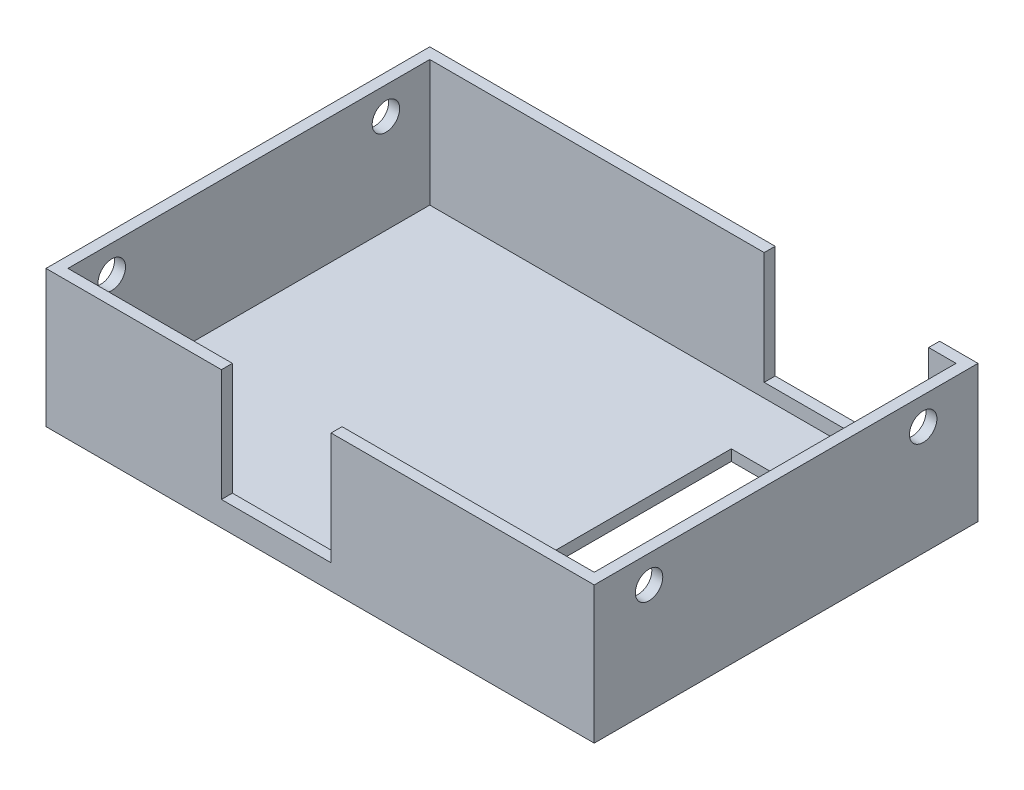
ISO-10303-21;
HEADER;
FILE_DESCRIPTION(('STEP AP214'),'2;1');
FILE_NAME('part.step','',(''),(''),'','','');
FILE_SCHEMA(('AUTOMOTIVE_DESIGN { 1 0 10303 214 1 1 1 1 }'));
ENDSEC;
DATA;
#1=APPLICATION_CONTEXT('core data for automotive mechanical design processes');
#2=APPLICATION_PROTOCOL_DEFINITION('international standard','automotive_design',2000,#1);
#3=PRODUCT_CONTEXT('',#1,'mechanical');
#4=PRODUCT('Part','Part','',(#3));
#5=PRODUCT_RELATED_PRODUCT_CATEGORY('part','',(#4));
#6=PRODUCT_DEFINITION_FORMATION('','',#4);
#7=PRODUCT_DEFINITION_CONTEXT('part definition',#1,'design');
#8=PRODUCT_DEFINITION('design','',#6,#7);
#9=PRODUCT_DEFINITION_SHAPE('','',#8);
#10=(LENGTH_UNIT() NAMED_UNIT(*) SI_UNIT(.MILLI.,.METRE.));
#11=(NAMED_UNIT(*) PLANE_ANGLE_UNIT() SI_UNIT($,.RADIAN.));
#12=(NAMED_UNIT(*) SI_UNIT($,.STERADIAN.) SOLID_ANGLE_UNIT());
#13=UNCERTAINTY_MEASURE_WITH_UNIT(LENGTH_MEASURE(1.E-05),#10,'distance_accuracy_value','');
#14=(GEOMETRIC_REPRESENTATION_CONTEXT(3) GLOBAL_UNCERTAINTY_ASSIGNED_CONTEXT((#13)) GLOBAL_UNIT_ASSIGNED_CONTEXT((#10,
#11,#12)) REPRESENTATION_CONTEXT('',''));
#15=CARTESIAN_POINT('',(0.,0.,0.));
#16=DIRECTION('',(0.,0.,1.));
#17=DIRECTION('',(1.,0.,0.));
#18=AXIS2_PLACEMENT_3D('',#15,#16,#17);
#19=CARTESIAN_POINT('',(0.,31.75,0.));
#20=DIRECTION('',(0.,-1.,0.));
#21=DIRECTION('',(0.,0.,-1.));
#22=AXIS2_PLACEMENT_3D('',#19,#20,#21);
#23=PLANE('',#22);
#24=DIRECTION('',(1.,0.,0.));
#25=VECTOR('',#24,1.);
#26=CARTESIAN_POINT('',(0.,31.75,0.));
#27=LINE('',#26,#25);
#28=CARTESIAN_POINT('',(0.,31.75,0.));
#29=VERTEX_POINT('',#28);
#30=CARTESIAN_POINT('',(40.64,31.75,0.));
#31=VERTEX_POINT('',#30);
#32=EDGE_CURVE('E370',#29,#31,#27,.T.);
#33=ORIENTED_EDGE('',*,*,#32,.T.);
#34=DIRECTION('',(0.,0.,1.));
#35=VECTOR('',#34,1.);
#36=CARTESIAN_POINT('',(40.64,31.75,-2.54));
#37=LINE('',#36,#35);
#38=CARTESIAN_POINT('',(40.64,31.75,-2.54));
#39=VERTEX_POINT('',#38);
#40=EDGE_CURVE('E250',#39,#31,#37,.T.);
#41=ORIENTED_EDGE('',*,*,#40,.F.);
#42=DIRECTION('',(1.,0.,0.));
#43=VECTOR('',#42,1.);
#44=CARTESIAN_POINT('',(0.,31.75,-2.54));
#45=LINE('',#44,#43);
#46=CARTESIAN_POINT('',(2.54,31.75,-2.54));
#47=VERTEX_POINT('',#46);
#48=EDGE_CURVE('E352',#47,#39,#45,.T.);
#49=ORIENTED_EDGE('',*,*,#48,.F.);
#50=DIRECTION('',(0.,0.,1.));
#51=VECTOR('',#50,1.);
#52=CARTESIAN_POINT('',(2.54,31.75,0.));
#53=LINE('',#52,#51);
#54=CARTESIAN_POINT('',(2.53999999999995,31.75,-86.36));
#55=VERTEX_POINT('',#54);
#56=EDGE_CURVE('E348',#55,#47,#53,.T.);
#57=ORIENTED_EDGE('',*,*,#56,.F.);
#58=DIRECTION('',(-1.,0.,0.));
#59=VECTOR('',#58,1.);
#60=CARTESIAN_POINT('',(0.,31.75,-86.36));
#61=LINE('',#60,#59);
#62=CARTESIAN_POINT('',(80.0099999999999,31.75,-86.36));
#63=VERTEX_POINT('',#62);
#64=EDGE_CURVE('E360',#63,#55,#61,.T.);
#65=ORIENTED_EDGE('',*,*,#64,.F.);
#66=DIRECTION('',(0.,0.,-1.));
#67=VECTOR('',#66,1.);
#68=CARTESIAN_POINT('',(80.0099999999999,31.75,-86.36));
#69=LINE('',#68,#67);
#70=CARTESIAN_POINT('',(80.0099999999999,31.75,-88.9));
#71=VERTEX_POINT('',#70);
#72=EDGE_CURVE('E290',#63,#71,#69,.T.);
#73=ORIENTED_EDGE('',*,*,#72,.T.);
#74=DIRECTION('',(-1.,0.,0.));
#75=VECTOR('',#74,1.);
#76=CARTESIAN_POINT('',(0.,31.75,-88.9));
#77=LINE('',#76,#75);
#78=CARTESIAN_POINT('',(0.,31.75,-88.9));
#79=VERTEX_POINT('',#78);
#80=EDGE_CURVE('E377',#71,#79,#77,.T.);
#81=ORIENTED_EDGE('',*,*,#80,.T.);
#82=DIRECTION('',(0.,0.,1.));
#83=VECTOR('',#82,1.);
#84=CARTESIAN_POINT('',(0.,31.75,0.));
#85=LINE('',#84,#83);
#86=EDGE_CURVE('E364',#79,#29,#85,.T.);
#87=ORIENTED_EDGE('',*,*,#86,.T.);
#88=EDGE_LOOP('',(#33,#41,#49,#57,#65,#73,#81,#87));
#89=FACE_BOUND('',#88,.T.);
#90=ADVANCED_FACE('F38',(#89),#23,.F.);
#91=CARTESIAN_POINT('',(66.04,31.75,-2.54));
#92=VERTEX_POINT('',#91);
#93=CARTESIAN_POINT('',(124.46,31.75,-2.54));
#94=VERTEX_POINT('',#93);
#95=EDGE_CURVE('E351',#92,#94,#45,.T.);
#96=ORIENTED_EDGE('',*,*,#95,.F.);
#97=DIRECTION('',(0.,0.,1.));
#98=VECTOR('',#97,1.);
#99=CARTESIAN_POINT('',(66.04,31.75,-2.54));
#100=LINE('',#99,#98);
#101=CARTESIAN_POINT('',(66.04,31.75,0.));
#102=VERTEX_POINT('',#101);
#103=EDGE_CURVE('E254',#92,#102,#100,.T.);
#104=ORIENTED_EDGE('',*,*,#103,.T.);
#105=CARTESIAN_POINT('',(127.,31.75,0.));
#106=VERTEX_POINT('',#105);
#107=EDGE_CURVE('E368',#102,#106,#27,.T.);
#108=ORIENTED_EDGE('',*,*,#107,.T.);
#109=DIRECTION('',(0.,0.,-1.));
#110=VECTOR('',#109,1.);
#111=CARTESIAN_POINT('',(127.,31.75,0.));
#112=LINE('',#111,#110);
#113=CARTESIAN_POINT('',(127.,31.75,-88.9));
#114=VERTEX_POINT('',#113);
#115=EDGE_CURVE('E374',#106,#114,#112,.T.);
#116=ORIENTED_EDGE('',*,*,#115,.T.);
#117=CARTESIAN_POINT('',(118.11,31.75,-88.9));
#118=VERTEX_POINT('',#117);
#119=EDGE_CURVE('E378',#114,#118,#77,.T.);
#120=ORIENTED_EDGE('',*,*,#119,.T.);
#121=DIRECTION('',(0.,0.,-1.));
#122=VECTOR('',#121,1.);
#123=CARTESIAN_POINT('',(118.11,31.75,-86.36));
#124=LINE('',#123,#122);
#125=CARTESIAN_POINT('',(118.11,31.75,-86.36));
#126=VERTEX_POINT('',#125);
#127=EDGE_CURVE('E286',#126,#118,#124,.T.);
#128=ORIENTED_EDGE('',*,*,#127,.F.);
#129=CARTESIAN_POINT('',(124.46,31.75,-86.36));
#130=VERTEX_POINT('',#129);
#131=EDGE_CURVE('E333',#130,#126,#61,.T.);
#132=ORIENTED_EDGE('',*,*,#131,.F.);
#133=DIRECTION('',(0.,0.,-1.));
#134=VECTOR('',#133,1.);
#135=CARTESIAN_POINT('',(124.46,31.75,0.));
#136=LINE('',#135,#134);
#137=EDGE_CURVE('E356',#94,#130,#136,.T.);
#138=ORIENTED_EDGE('',*,*,#137,.F.);
#139=EDGE_LOOP('',(#96,#104,#108,#116,#120,#128,#132,#138));
#140=FACE_BOUND('',#139,.T.);
#141=ADVANCED_FACE('F430',(#140),#23,.F.);
#142=CARTESIAN_POINT('',(0.,31.75,0.));
#143=DIRECTION('',(1.,0.,0.));
#144=DIRECTION('',(0.,0.,-1.));
#145=AXIS2_PLACEMENT_3D('',#142,#143,#144);
#146=PLANE('',#145);
#147=CARTESIAN_POINT('',(0.,25.4,-12.6999999999999));
#148=DIRECTION('',(1.,0.,0.));
#149=DIRECTION('',(0.,0.,-1.));
#150=AXIS2_PLACEMENT_3D('',#147,#148,#149);
#151=CIRCLE('',#150,3.175);
#152=CARTESIAN_POINT('',(0.,25.4,-15.8749999999999));
#153=VERTEX_POINT('',#152);
#154=EDGE_CURVE('E299',#153,#153,#151,.T.);
#155=ORIENTED_EDGE('',*,*,#154,.T.);
#156=EDGE_LOOP('',(#155));
#157=FACE_BOUND('',#156,.T.);
#158=CARTESIAN_POINT('',(0.,25.4,-76.1999999999999));
#159=DIRECTION('',(1.,0.,0.));
#160=DIRECTION('',(0.,0.,-1.));
#161=AXIS2_PLACEMENT_3D('',#158,#159,#160);
#162=CIRCLE('',#161,3.175);
#163=CARTESIAN_POINT('',(0.,25.4,-79.3749999999999));
#164=VERTEX_POINT('',#163);
#165=EDGE_CURVE('E289',#164,#164,#162,.T.);
#166=ORIENTED_EDGE('',*,*,#165,.T.);
#167=EDGE_LOOP('',(#166));
#168=FACE_BOUND('',#167,.T.);
#169=DIRECTION('',(0.,0.,1.));
#170=VECTOR('',#169,1.);
#171=CARTESIAN_POINT('',(0.,0.,0.));
#172=LINE('',#171,#170);
#173=CARTESIAN_POINT('',(0.,0.,-88.9));
#174=VERTEX_POINT('',#173);
#175=CARTESIAN_POINT('',(0.,0.,0.));
#176=VERTEX_POINT('',#175);
#177=EDGE_CURVE('E326',#174,#176,#172,.T.);
#178=ORIENTED_EDGE('',*,*,#177,.T.);
#179=DIRECTION('',(0.,-1.,0.));
#180=VECTOR('',#179,1.);
#181=CARTESIAN_POINT('',(0.,31.75,0.));
#182=LINE('',#181,#180);
#183=EDGE_CURVE('E11',#29,#176,#182,.T.);
#184=ORIENTED_EDGE('',*,*,#183,.F.);
#185=ORIENTED_EDGE('',*,*,#86,.F.);
#186=DIRECTION('',(0.,-1.,0.));
#187=VECTOR('',#186,1.);
#188=CARTESIAN_POINT('',(0.,31.75,-88.9));
#189=LINE('',#188,#187);
#190=EDGE_CURVE('E382',#79,#174,#189,.T.);
#191=ORIENTED_EDGE('',*,*,#190,.T.);
#192=EDGE_LOOP('',(#178,#184,#185,#191));
#193=FACE_BOUND('',#192,.T.);
#194=ADVANCED_FACE('F40',(#157,#168,#193),#146,.F.);
#195=CARTESIAN_POINT('',(0.,31.75,0.));
#196=DIRECTION('',(0.,0.,-1.));
#197=DIRECTION('',(-1.,0.,0.));
#198=AXIS2_PLACEMENT_3D('',#195,#196,#197);
#199=PLANE('',#198);
#200=DIRECTION('',(1.,0.,0.));
#201=VECTOR('',#200,1.);
#202=CARTESIAN_POINT('',(40.64,5.715,0.));
#203=LINE('',#202,#201);
#204=CARTESIAN_POINT('',(40.64,5.715,0.));
#205=VERTEX_POINT('',#204);
#206=CARTESIAN_POINT('',(66.04,5.715,0.));
#207=VERTEX_POINT('',#206);
#208=EDGE_CURVE('E244',#205,#207,#203,.T.);
#209=ORIENTED_EDGE('',*,*,#208,.F.);
#210=DIRECTION('',(0.,-1.,0.));
#211=VECTOR('',#210,1.);
#212=CARTESIAN_POINT('',(40.64,31.75,0.));
#213=LINE('',#212,#211);
#214=EDGE_CURVE('E221',#31,#205,#213,.T.);
#215=ORIENTED_EDGE('',*,*,#214,.F.);
#216=ORIENTED_EDGE('',*,*,#32,.F.);
#217=ORIENTED_EDGE('',*,*,#183,.T.);
#218=DIRECTION('',(1.,0.,0.));
#219=VECTOR('',#218,1.);
#220=CARTESIAN_POINT('',(0.,0.,0.));
#221=LINE('',#220,#219);
#222=CARTESIAN_POINT('',(127.,0.,0.));
#223=VERTEX_POINT('',#222);
#224=EDGE_CURVE('E386',#176,#223,#221,.T.);
#225=ORIENTED_EDGE('',*,*,#224,.T.);
#226=DIRECTION('',(0.,-1.,0.));
#227=VECTOR('',#226,1.);
#228=CARTESIAN_POINT('',(127.,31.75,0.));
#229=LINE('',#228,#227);
#230=EDGE_CURVE('E48',#106,#223,#229,.T.);
#231=ORIENTED_EDGE('',*,*,#230,.F.);
#232=ORIENTED_EDGE('',*,*,#107,.F.);
#233=DIRECTION('',(0.,1.,0.));
#234=VECTOR('',#233,1.);
#235=CARTESIAN_POINT('',(66.04,31.75,0.));
#236=LINE('',#235,#234);
#237=EDGE_CURVE('E232',#207,#102,#236,.T.);
#238=ORIENTED_EDGE('',*,*,#237,.F.);
#239=EDGE_LOOP('',(#209,#215,#216,#217,#225,#231,#232,#238));
#240=FACE_BOUND('',#239,.T.);
#241=ADVANCED_FACE('F429',(#240),#199,.F.);
#242=CARTESIAN_POINT('',(127.,31.75,0.));
#243=DIRECTION('',(-1.,0.,0.));
#244=DIRECTION('',(0.,0.,1.));
#245=AXIS2_PLACEMENT_3D('',#242,#243,#244);
#246=PLANE('',#245);
#247=CARTESIAN_POINT('',(127.,25.4,-12.7));
#248=DIRECTION('',(1.,0.,0.));
#249=DIRECTION('',(0.,0.,-1.));
#250=AXIS2_PLACEMENT_3D('',#247,#248,#249);
#251=CIRCLE('',#250,3.175);
#252=CARTESIAN_POINT('',(127.,25.4,-15.875));
#253=VERTEX_POINT('',#252);
#254=EDGE_CURVE('E307',#253,#253,#251,.T.);
#255=ORIENTED_EDGE('',*,*,#254,.F.);
#256=EDGE_LOOP('',(#255));
#257=FACE_BOUND('',#256,.T.);
#258=CARTESIAN_POINT('',(127.,25.4,-76.2));
#259=DIRECTION('',(1.,0.,0.));
#260=DIRECTION('',(0.,0.,-1.));
#261=AXIS2_PLACEMENT_3D('',#258,#259,#260);
#262=CIRCLE('',#261,3.175);
#263=CARTESIAN_POINT('',(127.,25.4,-79.375));
#264=VERTEX_POINT('',#263);
#265=EDGE_CURVE('E312',#264,#264,#262,.T.);
#266=ORIENTED_EDGE('',*,*,#265,.F.);
#267=EDGE_LOOP('',(#266));
#268=FACE_BOUND('',#267,.T.);
#269=DIRECTION('',(0.,0.,-1.));
#270=VECTOR('',#269,1.);
#271=CARTESIAN_POINT('',(127.,0.,0.));
#272=LINE('',#271,#270);
#273=CARTESIAN_POINT('',(127.,0.,-88.9));
#274=VERTEX_POINT('',#273);
#275=EDGE_CURVE('E389',#223,#274,#272,.T.);
#276=ORIENTED_EDGE('',*,*,#275,.T.);
#277=DIRECTION('',(0.,-1.,0.));
#278=VECTOR('',#277,1.);
#279=CARTESIAN_POINT('',(127.,31.75,-88.9));
#280=LINE('',#279,#278);
#281=EDGE_CURVE('E397',#114,#274,#280,.T.);
#282=ORIENTED_EDGE('',*,*,#281,.F.);
#283=ORIENTED_EDGE('',*,*,#115,.F.);
#284=ORIENTED_EDGE('',*,*,#230,.T.);
#285=EDGE_LOOP('',(#276,#282,#283,#284));
#286=FACE_BOUND('',#285,.T.);
#287=ADVANCED_FACE('F459',(#257,#268,#286),#246,.F.);
#288=CARTESIAN_POINT('',(0.,31.75,-88.9));
#289=DIRECTION('',(0.,0.,1.));
#290=DIRECTION('',(1.,0.,0.));
#291=AXIS2_PLACEMENT_3D('',#288,#289,#290);
#292=PLANE('',#291);
#293=DIRECTION('',(-1.,0.,0.));
#294=VECTOR('',#293,1.);
#295=CARTESIAN_POINT('',(118.11,5.715,-88.9));
#296=LINE('',#295,#294);
#297=CARTESIAN_POINT('',(118.11,5.715,-88.9));
#298=VERTEX_POINT('',#297);
#299=CARTESIAN_POINT('',(80.0099999999999,5.715,-88.9));
#300=VERTEX_POINT('',#299);
#301=EDGE_CURVE('E280',#298,#300,#296,.T.);
#302=ORIENTED_EDGE('',*,*,#301,.F.);
#303=DIRECTION('',(0.,-1.,0.));
#304=VECTOR('',#303,1.);
#305=CARTESIAN_POINT('',(118.11,31.75,-88.9));
#306=LINE('',#305,#304);
#307=EDGE_CURVE('E253',#118,#298,#306,.T.);
#308=ORIENTED_EDGE('',*,*,#307,.F.);
#309=ORIENTED_EDGE('',*,*,#119,.F.);
#310=ORIENTED_EDGE('',*,*,#281,.T.);
#311=DIRECTION('',(-1.,0.,0.));
#312=VECTOR('',#311,1.);
#313=CARTESIAN_POINT('',(0.,0.,-88.9));
#314=LINE('',#313,#312);
#315=EDGE_CURVE('E369',#274,#174,#314,.T.);
#316=ORIENTED_EDGE('',*,*,#315,.T.);
#317=ORIENTED_EDGE('',*,*,#190,.F.);
#318=ORIENTED_EDGE('',*,*,#80,.F.);
#319=DIRECTION('',(0.,1.,0.));
#320=VECTOR('',#319,1.);
#321=CARTESIAN_POINT('',(80.0099999999999,31.75,-88.9));
#322=LINE('',#321,#320);
#323=EDGE_CURVE('E268',#300,#71,#322,.T.);
#324=ORIENTED_EDGE('',*,*,#323,.F.);
#325=EDGE_LOOP('',(#302,#308,#309,#310,#316,#317,#318,#324));
#326=FACE_BOUND('',#325,.T.);
#327=ADVANCED_FACE('F453',(#326),#292,.F.);
#328=CARTESIAN_POINT('',(0.,0.,0.));
#329=DIRECTION('',(0.,-1.,0.));
#330=DIRECTION('',(0.,0.,-1.));
#331=AXIS2_PLACEMENT_3D('',#328,#329,#330);
#332=PLANE('',#331);
#333=DIRECTION('',(0.,0.,-1.));
#334=VECTOR('',#333,1.);
#335=CARTESIAN_POINT('',(86.36,0.,-8.89));
#336=LINE('',#335,#334);
#337=CARTESIAN_POINT('',(86.36,0.,-8.89));
#338=VERTEX_POINT('',#337);
#339=CARTESIAN_POINT('',(86.36,0.,-72.39));
#340=VERTEX_POINT('',#339);
#341=EDGE_CURVE('E56',#338,#340,#336,.T.);
#342=ORIENTED_EDGE('',*,*,#341,.F.);
#343=DIRECTION('',(-1.,0.,0.));
#344=VECTOR('',#343,1.);
#345=CARTESIAN_POINT('',(86.36,0.,-8.89));
#346=LINE('',#345,#344);
#347=CARTESIAN_POINT('',(111.76,0.,-8.89));
#348=VERTEX_POINT('',#347);
#349=EDGE_CURVE('E199',#348,#338,#346,.T.);
#350=ORIENTED_EDGE('',*,*,#349,.F.);
#351=DIRECTION('',(0.,0.,1.));
#352=VECTOR('',#351,1.);
#353=CARTESIAN_POINT('',(111.76,0.,-8.89));
#354=LINE('',#353,#352);
#355=CARTESIAN_POINT('',(111.76,0.,-72.39));
#356=VERTEX_POINT('',#355);
#357=EDGE_CURVE('E203',#356,#348,#354,.T.);
#358=ORIENTED_EDGE('',*,*,#357,.F.);
#359=DIRECTION('',(1.,0.,0.));
#360=VECTOR('',#359,1.);
#361=CARTESIAN_POINT('',(86.36,0.,-72.39));
#362=LINE('',#361,#360);
#363=EDGE_CURVE('E212',#340,#356,#362,.T.);
#364=ORIENTED_EDGE('',*,*,#363,.F.);
#365=EDGE_LOOP('',(#342,#350,#358,#364));
#366=FACE_BOUND('',#365,.T.);
#367=ORIENTED_EDGE('',*,*,#177,.F.);
#368=ORIENTED_EDGE('',*,*,#315,.F.);
#369=ORIENTED_EDGE('',*,*,#275,.F.);
#370=ORIENTED_EDGE('',*,*,#224,.F.);
#371=EDGE_LOOP('',(#367,#368,#369,#370));
#372=FACE_BOUND('',#371,.T.);
#373=ADVANCED_FACE('F439',(#366,#372),#332,.T.);
#374=CARTESIAN_POINT('',(2.54,31.75,0.));
#375=DIRECTION('',(1.,0.,0.));
#376=DIRECTION('',(0.,0.,-1.));
#377=AXIS2_PLACEMENT_3D('',#374,#375,#376);
#378=PLANE('',#377);
#379=CARTESIAN_POINT('',(2.53999999999999,25.4,-12.6999999999999));
#380=DIRECTION('',(1.,0.,0.));
#381=DIRECTION('',(0.,0.,-1.));
#382=AXIS2_PLACEMENT_3D('',#379,#380,#381);
#383=CIRCLE('',#382,3.175);
#384=CARTESIAN_POINT('',(2.53999999999999,25.4,-15.8749999999999));
#385=VERTEX_POINT('',#384);
#386=EDGE_CURVE('E42',#385,#385,#383,.F.);
#387=ORIENTED_EDGE('',*,*,#386,.T.);
#388=EDGE_LOOP('',(#387));
#389=FACE_BOUND('',#388,.T.);
#390=CARTESIAN_POINT('',(2.53999999999995,25.4,-76.1999999999999));
#391=DIRECTION('',(1.,0.,0.));
#392=DIRECTION('',(0.,0.,-1.));
#393=AXIS2_PLACEMENT_3D('',#390,#391,#392);
#394=CIRCLE('',#393,3.175);
#395=CARTESIAN_POINT('',(2.53999999999995,25.4,-79.3749999999999));
#396=VERTEX_POINT('',#395);
#397=EDGE_CURVE('E303',#396,#396,#394,.F.);
#398=ORIENTED_EDGE('',*,*,#397,.T.);
#399=EDGE_LOOP('',(#398));
#400=FACE_BOUND('',#399,.T.);
#401=DIRECTION('',(0.,0.,1.));
#402=VECTOR('',#401,1.);
#403=CARTESIAN_POINT('',(2.54,2.54,0.));
#404=LINE('',#403,#402);
#405=CARTESIAN_POINT('',(2.53999999999995,2.54,-86.36));
#406=VERTEX_POINT('',#405);
#407=CARTESIAN_POINT('',(2.54,2.54,-2.54));
#408=VERTEX_POINT('',#407);
#409=EDGE_CURVE('E316',#406,#408,#404,.T.);
#410=ORIENTED_EDGE('',*,*,#409,.F.);
#411=DIRECTION('',(0.,-1.,0.));
#412=VECTOR('',#411,1.);
#413=CARTESIAN_POINT('',(2.53999999999995,31.75,-86.36));
#414=LINE('',#413,#412);
#415=EDGE_CURVE('E328',#55,#406,#414,.T.);
#416=ORIENTED_EDGE('',*,*,#415,.F.);
#417=ORIENTED_EDGE('',*,*,#56,.T.);
#418=DIRECTION('',(0.,-1.,0.));
#419=VECTOR('',#418,1.);
#420=CARTESIAN_POINT('',(2.54,31.75,-2.54));
#421=LINE('',#420,#419);
#422=EDGE_CURVE('E322',#47,#408,#421,.T.);
#423=ORIENTED_EDGE('',*,*,#422,.T.);
#424=EDGE_LOOP('',(#410,#416,#417,#423));
#425=FACE_BOUND('',#424,.T.);
#426=ADVANCED_FACE('F417',(#389,#400,#425),#378,.T.);
#427=CARTESIAN_POINT('',(0.,31.75,-2.54));
#428=DIRECTION('',(0.,0.,-1.));
#429=DIRECTION('',(-1.,0.,0.));
#430=AXIS2_PLACEMENT_3D('',#427,#428,#429);
#431=PLANE('',#430);
#432=DIRECTION('',(0.,-1.,0.));
#433=VECTOR('',#432,1.);
#434=CARTESIAN_POINT('',(40.64,31.75,-2.54));
#435=LINE('',#434,#433);
#436=CARTESIAN_POINT('',(40.64,5.715,-2.54));
#437=VERTEX_POINT('',#436);
#438=EDGE_CURVE('E227',#39,#437,#435,.T.);
#439=ORIENTED_EDGE('',*,*,#438,.T.);
#440=DIRECTION('',(1.,0.,0.));
#441=VECTOR('',#440,1.);
#442=CARTESIAN_POINT('',(40.64,5.715,-2.54));
#443=LINE('',#442,#441);
#444=CARTESIAN_POINT('',(66.04,5.715,-2.54));
#445=VERTEX_POINT('',#444);
#446=EDGE_CURVE('E231',#437,#445,#443,.T.);
#447=ORIENTED_EDGE('',*,*,#446,.T.);
#448=DIRECTION('',(0.,1.,0.));
#449=VECTOR('',#448,1.);
#450=CARTESIAN_POINT('',(66.04,31.75,-2.54));
#451=LINE('',#450,#449);
#452=EDGE_CURVE('E236',#445,#92,#451,.T.);
#453=ORIENTED_EDGE('',*,*,#452,.T.);
#454=ORIENTED_EDGE('',*,*,#95,.T.);
#455=DIRECTION('',(0.,-1.,0.));
#456=VECTOR('',#455,1.);
#457=CARTESIAN_POINT('',(124.46,31.75,-2.54));
#458=LINE('',#457,#456);
#459=CARTESIAN_POINT('',(124.46,2.54,-2.54));
#460=VERTEX_POINT('',#459);
#461=EDGE_CURVE('E327',#94,#460,#458,.T.);
#462=ORIENTED_EDGE('',*,*,#461,.T.);
#463=DIRECTION('',(1.,0.,0.));
#464=VECTOR('',#463,1.);
#465=CARTESIAN_POINT('',(0.,2.54,-2.54));
#466=LINE('',#465,#464);
#467=EDGE_CURVE('E320',#408,#460,#466,.T.);
#468=ORIENTED_EDGE('',*,*,#467,.F.);
#469=ORIENTED_EDGE('',*,*,#422,.F.);
#470=ORIENTED_EDGE('',*,*,#48,.T.);
#471=EDGE_LOOP('',(#439,#447,#453,#454,#462,#468,#469,#470));
#472=FACE_BOUND('',#471,.T.);
#473=ADVANCED_FACE('F469',(#472),#431,.T.);
#474=CARTESIAN_POINT('',(124.46,31.75,0.));
#475=DIRECTION('',(-1.,0.,0.));
#476=DIRECTION('',(0.,0.,1.));
#477=AXIS2_PLACEMENT_3D('',#474,#475,#476);
#478=PLANE('',#477);
#479=CARTESIAN_POINT('',(124.46,25.4,-12.7));
#480=DIRECTION('',(-1.,0.,0.));
#481=DIRECTION('',(0.,0.,1.));
#482=AXIS2_PLACEMENT_3D('',#479,#480,#481);
#483=CIRCLE('',#482,3.175);
#484=CARTESIAN_POINT('',(124.46,25.4,-9.525));
#485=VERTEX_POINT('',#484);
#486=EDGE_CURVE('E321',#485,#485,#483,.T.);
#487=ORIENTED_EDGE('',*,*,#486,.F.);
#488=EDGE_LOOP('',(#487));
#489=FACE_BOUND('',#488,.T.);
#490=CARTESIAN_POINT('',(124.46,25.4,-76.2));
#491=DIRECTION('',(-1.,0.,0.));
#492=DIRECTION('',(0.,0.,1.));
#493=AXIS2_PLACEMENT_3D('',#490,#491,#492);
#494=CIRCLE('',#493,3.175);
#495=CARTESIAN_POINT('',(124.46,25.4,-73.025));
#496=VERTEX_POINT('',#495);
#497=EDGE_CURVE('E311',#496,#496,#494,.T.);
#498=ORIENTED_EDGE('',*,*,#497,.F.);
#499=EDGE_LOOP('',(#498));
#500=FACE_BOUND('',#499,.T.);
#501=DIRECTION('',(0.,0.,-1.));
#502=VECTOR('',#501,1.);
#503=CARTESIAN_POINT('',(124.46,2.54,0.));
#504=LINE('',#503,#502);
#505=CARTESIAN_POINT('',(124.46,2.54,-86.36));
#506=VERTEX_POINT('',#505);
#507=EDGE_CURVE('E336',#460,#506,#504,.T.);
#508=ORIENTED_EDGE('',*,*,#507,.F.);
#509=ORIENTED_EDGE('',*,*,#461,.F.);
#510=ORIENTED_EDGE('',*,*,#137,.T.);
#511=DIRECTION('',(0.,-1.,0.));
#512=VECTOR('',#511,1.);
#513=CARTESIAN_POINT('',(124.46,31.75,-86.36));
#514=LINE('',#513,#512);
#515=EDGE_CURVE('E332',#130,#506,#514,.T.);
#516=ORIENTED_EDGE('',*,*,#515,.T.);
#517=EDGE_LOOP('',(#508,#509,#510,#516));
#518=FACE_BOUND('',#517,.T.);
#519=ADVANCED_FACE('F473',(#489,#500,#518),#478,.T.);
#520=CARTESIAN_POINT('',(0.,31.75,-86.36));
#521=DIRECTION('',(0.,0.,1.));
#522=DIRECTION('',(1.,0.,0.));
#523=AXIS2_PLACEMENT_3D('',#520,#521,#522);
#524=PLANE('',#523);
#525=DIRECTION('',(0.,-1.,0.));
#526=VECTOR('',#525,1.);
#527=CARTESIAN_POINT('',(118.11,31.75,-86.36));
#528=LINE('',#527,#526);
#529=CARTESIAN_POINT('',(118.11,5.715,-86.36));
#530=VERTEX_POINT('',#529);
#531=EDGE_CURVE('E263',#126,#530,#528,.T.);
#532=ORIENTED_EDGE('',*,*,#531,.T.);
#533=DIRECTION('',(-1.,0.,0.));
#534=VECTOR('',#533,1.);
#535=CARTESIAN_POINT('',(118.11,5.715,-86.36));
#536=LINE('',#535,#534);
#537=CARTESIAN_POINT('',(80.0099999999999,5.715,-86.36));
#538=VERTEX_POINT('',#537);
#539=EDGE_CURVE('E267',#530,#538,#536,.T.);
#540=ORIENTED_EDGE('',*,*,#539,.T.);
#541=DIRECTION('',(0.,1.,0.));
#542=VECTOR('',#541,1.);
#543=CARTESIAN_POINT('',(80.0099999999999,31.75,-86.36));
#544=LINE('',#543,#542);
#545=EDGE_CURVE('E272',#538,#63,#544,.T.);
#546=ORIENTED_EDGE('',*,*,#545,.T.);
#547=ORIENTED_EDGE('',*,*,#64,.T.);
#548=ORIENTED_EDGE('',*,*,#415,.T.);
#549=DIRECTION('',(-1.,0.,0.));
#550=VECTOR('',#549,1.);
#551=CARTESIAN_POINT('',(0.,2.54,-86.36));
#552=LINE('',#551,#550);
#553=EDGE_CURVE('E342',#506,#406,#552,.T.);
#554=ORIENTED_EDGE('',*,*,#553,.F.);
#555=ORIENTED_EDGE('',*,*,#515,.F.);
#556=ORIENTED_EDGE('',*,*,#131,.T.);
#557=EDGE_LOOP('',(#532,#540,#546,#547,#548,#554,#555,#556));
#558=FACE_BOUND('',#557,.T.);
#559=ADVANCED_FACE('F477',(#558),#524,.T.);
#560=CARTESIAN_POINT('',(0.,2.54,0.));
#561=DIRECTION('',(0.,-1.,0.));
#562=DIRECTION('',(0.,0.,-1.));
#563=AXIS2_PLACEMENT_3D('',#560,#561,#562);
#564=PLANE('',#563);
#565=DIRECTION('',(-1.,0.,0.));
#566=VECTOR('',#565,1.);
#567=CARTESIAN_POINT('',(86.36,2.54,-8.89));
#568=LINE('',#567,#566);
#569=CARTESIAN_POINT('',(111.76,2.54,-8.89));
#570=VERTEX_POINT('',#569);
#571=CARTESIAN_POINT('',(86.36,2.54,-8.89));
#572=VERTEX_POINT('',#571);
#573=EDGE_CURVE('E187',#570,#572,#568,.T.);
#574=ORIENTED_EDGE('',*,*,#573,.T.);
#575=DIRECTION('',(0.,0.,-1.));
#576=VECTOR('',#575,1.);
#577=CARTESIAN_POINT('',(86.36,2.54,-8.89));
#578=LINE('',#577,#576);
#579=CARTESIAN_POINT('',(86.36,2.54,-72.39));
#580=VERTEX_POINT('',#579);
#581=EDGE_CURVE('E180',#572,#580,#578,.T.);
#582=ORIENTED_EDGE('',*,*,#581,.T.);
#583=DIRECTION('',(1.,0.,0.));
#584=VECTOR('',#583,1.);
#585=CARTESIAN_POINT('',(86.36,2.54,-72.39));
#586=LINE('',#585,#584);
#587=CARTESIAN_POINT('',(111.76,2.54,-72.39));
#588=VERTEX_POINT('',#587);
#589=EDGE_CURVE('E190',#580,#588,#586,.T.);
#590=ORIENTED_EDGE('',*,*,#589,.T.);
#591=DIRECTION('',(0.,0.,1.));
#592=VECTOR('',#591,1.);
#593=CARTESIAN_POINT('',(111.76,2.54,-8.89));
#594=LINE('',#593,#592);
#595=EDGE_CURVE('E64',#588,#570,#594,.T.);
#596=ORIENTED_EDGE('',*,*,#595,.T.);
#597=EDGE_LOOP('',(#574,#582,#590,#596));
#598=FACE_BOUND('',#597,.T.);
#599=ORIENTED_EDGE('',*,*,#409,.T.);
#600=ORIENTED_EDGE('',*,*,#467,.T.);
#601=ORIENTED_EDGE('',*,*,#507,.T.);
#602=ORIENTED_EDGE('',*,*,#553,.T.);
#603=EDGE_LOOP('',(#599,#600,#601,#602));
#604=FACE_BOUND('',#603,.T.);
#605=ADVANCED_FACE('F195',(#598,#604),#564,.F.);
#606=CARTESIAN_POINT('',(95.2499999999999,25.4,-76.2));
#607=DIRECTION('',(1.,0.,0.));
#608=DIRECTION('',(0.,0.,-1.));
#609=AXIS2_PLACEMENT_3D('',#606,#607,#608);
#610=CYLINDRICAL_SURFACE('',#609,3.175);
#611=ORIENTED_EDGE('',*,*,#497,.T.);
#612=EDGE_LOOP('',(#611));
#613=FACE_BOUND('',#612,.T.);
#614=ORIENTED_EDGE('',*,*,#265,.T.);
#615=EDGE_LOOP('',(#614));
#616=FACE_BOUND('',#615,.T.);
#617=ADVANCED_FACE('F562',(#613,#616),#610,.F.);
#618=CARTESIAN_POINT('',(95.25,25.4,-12.7));
#619=DIRECTION('',(1.,0.,0.));
#620=DIRECTION('',(0.,0.,-1.));
#621=AXIS2_PLACEMENT_3D('',#618,#619,#620);
#622=CYLINDRICAL_SURFACE('',#621,3.175);
#623=ORIENTED_EDGE('',*,*,#486,.T.);
#624=EDGE_LOOP('',(#623));
#625=FACE_BOUND('',#624,.T.);
#626=ORIENTED_EDGE('',*,*,#254,.T.);
#627=EDGE_LOOP('',(#626));
#628=FACE_BOUND('',#627,.T.);
#629=ADVANCED_FACE('F609',(#625,#628),#622,.F.);
#630=CARTESIAN_POINT('',(31.75,25.4,-76.1999999999999));
#631=DIRECTION('',(-1.,0.,0.));
#632=DIRECTION('',(0.,0.,1.));
#633=AXIS2_PLACEMENT_3D('',#630,#631,#632);
#634=CYLINDRICAL_SURFACE('',#633,3.175);
#635=ORIENTED_EDGE('',*,*,#397,.F.);
#636=EDGE_LOOP('',(#635));
#637=FACE_BOUND('',#636,.T.);
#638=ORIENTED_EDGE('',*,*,#165,.F.);
#639=EDGE_LOOP('',(#638));
#640=FACE_BOUND('',#639,.T.);
#641=ADVANCED_FACE('F423',(#637,#640),#634,.F.);
#642=CARTESIAN_POINT('',(31.75,25.4,-12.6999999999999));
#643=DIRECTION('',(-1.,0.,0.));
#644=DIRECTION('',(0.,0.,1.));
#645=AXIS2_PLACEMENT_3D('',#642,#643,#644);
#646=CYLINDRICAL_SURFACE('',#645,3.175);
#647=ORIENTED_EDGE('',*,*,#386,.F.);
#648=EDGE_LOOP('',(#647));
#649=FACE_BOUND('',#648,.T.);
#650=ORIENTED_EDGE('',*,*,#154,.F.);
#651=EDGE_LOOP('',(#650));
#652=FACE_BOUND('',#651,.T.);
#653=ADVANCED_FACE('F419',(#649,#652),#646,.F.);
#654=CARTESIAN_POINT('',(118.11,31.75,-86.36));
#655=DIRECTION('',(1.,0.,0.));
#656=DIRECTION('',(0.,0.,-1.));
#657=AXIS2_PLACEMENT_3D('',#654,#655,#656);
#658=PLANE('',#657);
#659=ORIENTED_EDGE('',*,*,#307,.T.);
#660=DIRECTION('',(0.,0.,-1.));
#661=VECTOR('',#660,1.);
#662=CARTESIAN_POINT('',(118.11,5.715,-86.36));
#663=LINE('',#662,#661);
#664=EDGE_CURVE('E276',#530,#298,#663,.T.);
#665=ORIENTED_EDGE('',*,*,#664,.F.);
#666=ORIENTED_EDGE('',*,*,#531,.F.);
#667=ORIENTED_EDGE('',*,*,#127,.T.);
#668=EDGE_LOOP('',(#659,#665,#666,#667));
#669=FACE_BOUND('',#668,.T.);
#670=ADVANCED_FACE('F422',(#669),#658,.F.);
#671=CARTESIAN_POINT('',(80.0099999999999,31.75,-86.36));
#672=DIRECTION('',(-1.,0.,0.));
#673=DIRECTION('',(0.,0.,1.));
#674=AXIS2_PLACEMENT_3D('',#671,#672,#673);
#675=PLANE('',#674);
#676=ORIENTED_EDGE('',*,*,#323,.T.);
#677=ORIENTED_EDGE('',*,*,#72,.F.);
#678=ORIENTED_EDGE('',*,*,#545,.F.);
#679=DIRECTION('',(0.,0.,-1.));
#680=VECTOR('',#679,1.);
#681=CARTESIAN_POINT('',(80.0099999999999,5.715,-86.36));
#682=LINE('',#681,#680);
#683=EDGE_CURVE('E294',#538,#300,#682,.T.);
#684=ORIENTED_EDGE('',*,*,#683,.T.);
#685=EDGE_LOOP('',(#676,#677,#678,#684));
#686=FACE_BOUND('',#685,.T.);
#687=ADVANCED_FACE('F642',(#686),#675,.F.);
#688=CARTESIAN_POINT('',(118.11,5.715,-86.36));
#689=DIRECTION('',(0.,-1.,0.));
#690=DIRECTION('',(0.,0.,-1.));
#691=AXIS2_PLACEMENT_3D('',#688,#689,#690);
#692=PLANE('',#691);
#693=ORIENTED_EDGE('',*,*,#301,.T.);
#694=ORIENTED_EDGE('',*,*,#683,.F.);
#695=ORIENTED_EDGE('',*,*,#539,.F.);
#696=ORIENTED_EDGE('',*,*,#664,.T.);
#697=EDGE_LOOP('',(#693,#694,#695,#696));
#698=FACE_BOUND('',#697,.T.);
#699=ADVANCED_FACE('F500',(#698),#692,.F.);
#700=CARTESIAN_POINT('',(40.64,31.75,-2.54));
#701=DIRECTION('',(-1.,0.,0.));
#702=DIRECTION('',(0.,0.,1.));
#703=AXIS2_PLACEMENT_3D('',#700,#701,#702);
#704=PLANE('',#703);
#705=ORIENTED_EDGE('',*,*,#214,.T.);
#706=DIRECTION('',(0.,0.,1.));
#707=VECTOR('',#706,1.);
#708=CARTESIAN_POINT('',(40.64,5.715,-2.54));
#709=LINE('',#708,#707);
#710=EDGE_CURVE('E240',#437,#205,#709,.T.);
#711=ORIENTED_EDGE('',*,*,#710,.F.);
#712=ORIENTED_EDGE('',*,*,#438,.F.);
#713=ORIENTED_EDGE('',*,*,#40,.T.);
#714=EDGE_LOOP('',(#705,#711,#712,#713));
#715=FACE_BOUND('',#714,.T.);
#716=ADVANCED_FACE('F487',(#715),#704,.F.);
#717=CARTESIAN_POINT('',(66.04,31.75,-2.54));
#718=DIRECTION('',(1.,0.,0.));
#719=DIRECTION('',(0.,0.,-1.));
#720=AXIS2_PLACEMENT_3D('',#717,#718,#719);
#721=PLANE('',#720);
#722=ORIENTED_EDGE('',*,*,#237,.T.);
#723=ORIENTED_EDGE('',*,*,#103,.F.);
#724=ORIENTED_EDGE('',*,*,#452,.F.);
#725=DIRECTION('',(0.,0.,1.));
#726=VECTOR('',#725,1.);
#727=CARTESIAN_POINT('',(66.04,5.715,-2.54));
#728=LINE('',#727,#726);
#729=EDGE_CURVE('E258',#445,#207,#728,.T.);
#730=ORIENTED_EDGE('',*,*,#729,.T.);
#731=EDGE_LOOP('',(#722,#723,#724,#730));
#732=FACE_BOUND('',#731,.T.);
#733=ADVANCED_FACE('F492',(#732),#721,.F.);
#734=CARTESIAN_POINT('',(40.64,5.715,-2.54));
#735=DIRECTION('',(0.,-1.,0.));
#736=DIRECTION('',(0.,0.,-1.));
#737=AXIS2_PLACEMENT_3D('',#734,#735,#736);
#738=PLANE('',#737);
#739=ORIENTED_EDGE('',*,*,#208,.T.);
#740=ORIENTED_EDGE('',*,*,#729,.F.);
#741=ORIENTED_EDGE('',*,*,#446,.F.);
#742=ORIENTED_EDGE('',*,*,#710,.T.);
#743=EDGE_LOOP('',(#739,#740,#741,#742));
#744=FACE_BOUND('',#743,.T.);
#745=ADVANCED_FACE('F490',(#744),#738,.F.);
#746=CARTESIAN_POINT('',(86.36,2.54,-8.89));
#747=DIRECTION('',(-1.,0.,0.));
#748=DIRECTION('',(0.,0.,1.));
#749=AXIS2_PLACEMENT_3D('',#746,#747,#748);
#750=PLANE('',#749);
#751=ORIENTED_EDGE('',*,*,#341,.T.);
#752=DIRECTION('',(0.,-1.,0.));
#753=VECTOR('',#752,1.);
#754=CARTESIAN_POINT('',(86.36,2.54,-72.39));
#755=LINE('',#754,#753);
#756=EDGE_CURVE('E176',#580,#340,#755,.T.);
#757=ORIENTED_EDGE('',*,*,#756,.F.);
#758=ORIENTED_EDGE('',*,*,#581,.F.);
#759=DIRECTION('',(0.,-1.,0.));
#760=VECTOR('',#759,1.);
#761=CARTESIAN_POINT('',(86.36,2.54,-8.89));
#762=LINE('',#761,#760);
#763=EDGE_CURVE('E218',#572,#338,#762,.T.);
#764=ORIENTED_EDGE('',*,*,#763,.T.);
#765=EDGE_LOOP('',(#751,#757,#758,#764));
#766=FACE_BOUND('',#765,.T.);
#767=ADVANCED_FACE('F178',(#766),#750,.F.);
#768=CARTESIAN_POINT('',(86.36,2.54,-8.89));
#769=DIRECTION('',(0.,0.,1.));
#770=DIRECTION('',(1.,0.,0.));
#771=AXIS2_PLACEMENT_3D('',#768,#769,#770);
#772=PLANE('',#771);
#773=ORIENTED_EDGE('',*,*,#349,.T.);
#774=ORIENTED_EDGE('',*,*,#763,.F.);
#775=ORIENTED_EDGE('',*,*,#573,.F.);
#776=DIRECTION('',(0.,-1.,0.));
#777=VECTOR('',#776,1.);
#778=CARTESIAN_POINT('',(111.76,2.54,-8.89));
#779=LINE('',#778,#777);
#780=EDGE_CURVE('E222',#570,#348,#779,.T.);
#781=ORIENTED_EDGE('',*,*,#780,.T.);
#782=EDGE_LOOP('',(#773,#774,#775,#781));
#783=FACE_BOUND('',#782,.T.);
#784=ADVANCED_FACE('F569',(#783),#772,.F.);
#785=CARTESIAN_POINT('',(111.76,2.54,-8.89));
#786=DIRECTION('',(1.,0.,0.));
#787=DIRECTION('',(0.,0.,-1.));
#788=AXIS2_PLACEMENT_3D('',#785,#786,#787);
#789=PLANE('',#788);
#790=ORIENTED_EDGE('',*,*,#357,.T.);
#791=ORIENTED_EDGE('',*,*,#780,.F.);
#792=ORIENTED_EDGE('',*,*,#595,.F.);
#793=DIRECTION('',(0.,-1.,0.));
#794=VECTOR('',#793,1.);
#795=CARTESIAN_POINT('',(111.76,2.54,-72.39));
#796=LINE('',#795,#794);
#797=EDGE_CURVE('E186',#588,#356,#796,.T.);
#798=ORIENTED_EDGE('',*,*,#797,.T.);
#799=EDGE_LOOP('',(#790,#791,#792,#798));
#800=FACE_BOUND('',#799,.T.);
#801=ADVANCED_FACE('F577',(#800),#789,.F.);
#802=CARTESIAN_POINT('',(86.36,2.54,-72.39));
#803=DIRECTION('',(0.,0.,-1.));
#804=DIRECTION('',(-1.,0.,0.));
#805=AXIS2_PLACEMENT_3D('',#802,#803,#804);
#806=PLANE('',#805);
#807=ORIENTED_EDGE('',*,*,#363,.T.);
#808=ORIENTED_EDGE('',*,*,#797,.F.);
#809=ORIENTED_EDGE('',*,*,#589,.F.);
#810=ORIENTED_EDGE('',*,*,#756,.T.);
#811=EDGE_LOOP('',(#807,#808,#809,#810));
#812=FACE_BOUND('',#811,.T.);
#813=ADVANCED_FACE('F191',(#812),#806,.F.);
#814=CLOSED_SHELL('',(#90,#141,#194,#241,#287,#327,#373,#426,#473,#519,#559,#605,#617,#629,#641,
#653,#670,#687,#699,#716,#733,#745,#767,#784,#801,#813));
#815=MANIFOLD_SOLID_BREP('B2',#814);
#816=ADVANCED_BREP_SHAPE_REPRESENTATION('',(#18,#815),#14);
#817=SHAPE_DEFINITION_REPRESENTATION(#9,#816);
ENDSEC;
END-ISO-10303-21;
